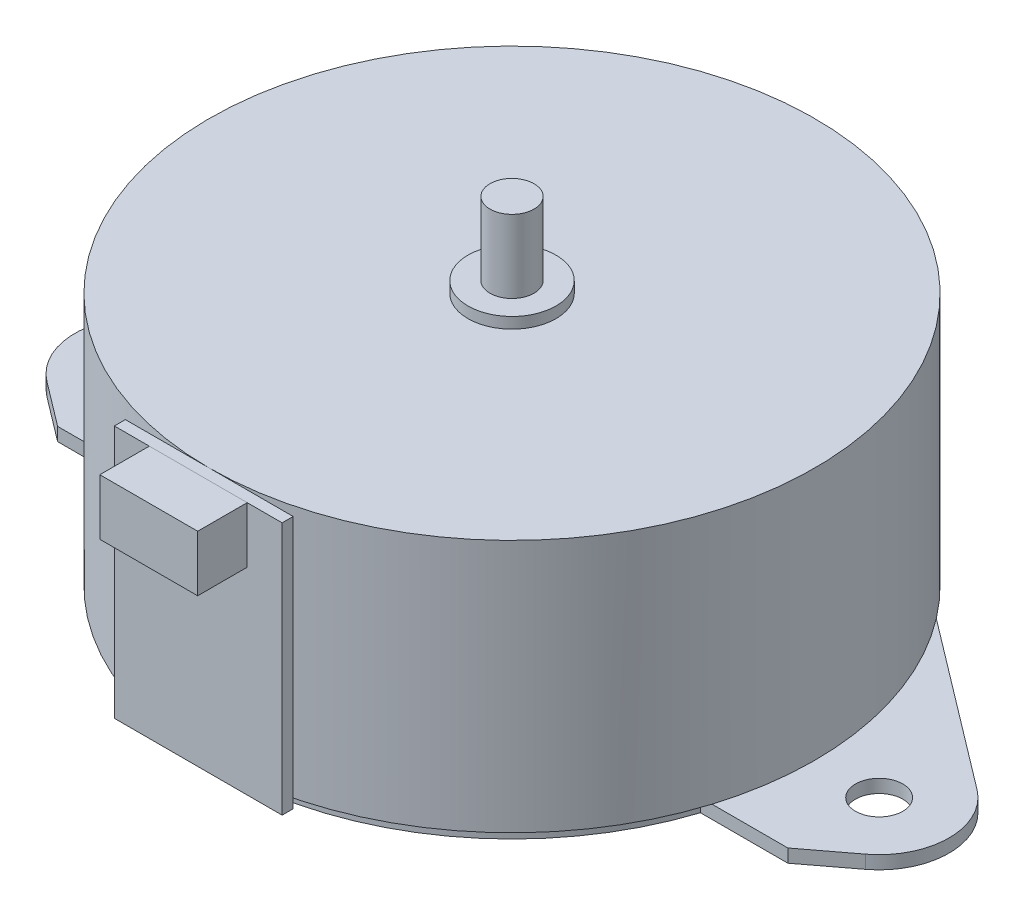
ISO-10303-21;
HEADER;
FILE_DESCRIPTION(('STEP AP214'),'2;1');
FILE_NAME('part.step','',(''),(''),'','','');
FILE_SCHEMA(('AUTOMOTIVE_DESIGN { 1 0 10303 214 1 1 1 1 }'));
ENDSEC;
DATA;
#1=APPLICATION_CONTEXT('core data for automotive mechanical design processes');
#2=APPLICATION_PROTOCOL_DEFINITION('international standard','automotive_design',2000,#1);
#3=PRODUCT_CONTEXT('',#1,'mechanical');
#4=PRODUCT('Part','Part','',(#3));
#5=PRODUCT_RELATED_PRODUCT_CATEGORY('part','',(#4));
#6=PRODUCT_DEFINITION_FORMATION('','',#4);
#7=PRODUCT_DEFINITION_CONTEXT('part definition',#1,'design');
#8=PRODUCT_DEFINITION('design','',#6,#7);
#9=PRODUCT_DEFINITION_SHAPE('','',#8);
#10=(LENGTH_UNIT() NAMED_UNIT(*) SI_UNIT(.MILLI.,.METRE.));
#11=(NAMED_UNIT(*) PLANE_ANGLE_UNIT() SI_UNIT($,.RADIAN.));
#12=(NAMED_UNIT(*) SI_UNIT($,.STERADIAN.) SOLID_ANGLE_UNIT());
#13=UNCERTAINTY_MEASURE_WITH_UNIT(LENGTH_MEASURE(1.E-05),#10,'distance_accuracy_value','');
#14=(GEOMETRIC_REPRESENTATION_CONTEXT(3) GLOBAL_UNCERTAINTY_ASSIGNED_CONTEXT((#13)) GLOBAL_UNIT_ASSIGNED_CONTEXT((#10,
#11,#12)) REPRESENTATION_CONTEXT('',''));
#15=CARTESIAN_POINT('',(0.,0.,0.));
#16=DIRECTION('',(0.,0.,1.));
#17=DIRECTION('',(1.,0.,0.));
#18=AXIS2_PLACEMENT_3D('',#15,#16,#17);
#19=CARTESIAN_POINT('',(-4.445,24.2,32.9958));
#20=DIRECTION('',(1.,0.,0.));
#21=DIRECTION('',(0.,1.,0.));
#22=AXIS2_PLACEMENT_3D('',#19,#20,#21);
#23=PLANE('',#22);
#24=DIRECTION('',(0.,-1.,0.));
#25=VECTOR('',#24,1.);
#26=CARTESIAN_POINT('',(-4.445,24.2,28.5));
#27=LINE('',#26,#25);
#28=CARTESIAN_POINT('',(-4.445,24.2,28.5));
#29=VERTEX_POINT('',#28);
#30=CARTESIAN_POINT('',(-4.445,19.12,28.5));
#31=VERTEX_POINT('',#30);
#32=EDGE_CURVE('E178',#29,#31,#27,.T.);
#33=ORIENTED_EDGE('',*,*,#32,.T.);
#34=DIRECTION('',(0.,0.,-1.));
#35=VECTOR('',#34,1.);
#36=CARTESIAN_POINT('',(-4.445,19.12,32.9958));
#37=LINE('',#36,#35);
#38=CARTESIAN_POINT('',(-4.445,19.12,32.9958));
#39=VERTEX_POINT('',#38);
#40=EDGE_CURVE('E13',#39,#31,#37,.T.);
#41=ORIENTED_EDGE('',*,*,#40,.F.);
#42=DIRECTION('',(0.,-1.,0.));
#43=VECTOR('',#42,1.);
#44=CARTESIAN_POINT('',(-4.445,24.2,32.9958));
#45=LINE('',#44,#43);
#46=CARTESIAN_POINT('',(-4.445,24.2,32.9958));
#47=VERTEX_POINT('',#46);
#48=EDGE_CURVE('E166',#47,#39,#45,.T.);
#49=ORIENTED_EDGE('',*,*,#48,.F.);
#50=DIRECTION('',(0.,0.,-1.));
#51=VECTOR('',#50,1.);
#52=CARTESIAN_POINT('',(-4.445,24.2,32.9958));
#53=LINE('',#52,#51);
#54=EDGE_CURVE('E174',#47,#29,#53,.T.);
#55=ORIENTED_EDGE('',*,*,#54,.T.);
#56=EDGE_LOOP('',(#33,#41,#49,#55));
#57=FACE_BOUND('',#56,.T.);
#58=ADVANCED_FACE('F115',(#57),#23,.F.);
#59=CARTESIAN_POINT('',(-4.445,19.12,32.9958));
#60=DIRECTION('',(0.,1.,0.));
#61=DIRECTION('',(0.,0.,1.));
#62=AXIS2_PLACEMENT_3D('',#59,#60,#61);
#63=PLANE('',#62);
#64=DIRECTION('',(1.,0.,0.));
#65=VECTOR('',#64,1.);
#66=CARTESIAN_POINT('',(-4.445,19.12,28.5));
#67=LINE('',#66,#65);
#68=CARTESIAN_POINT('',(4.445,19.12,28.5));
#69=VERTEX_POINT('',#68);
#70=EDGE_CURVE('E170',#31,#69,#67,.T.);
#71=ORIENTED_EDGE('',*,*,#70,.T.);
#72=DIRECTION('',(0.,0.,-1.));
#73=VECTOR('',#72,1.);
#74=CARTESIAN_POINT('',(4.445,19.12,32.9958));
#75=LINE('',#74,#73);
#76=CARTESIAN_POINT('',(4.445,19.12,32.9958));
#77=VERTEX_POINT('',#76);
#78=EDGE_CURVE('E123',#77,#69,#75,.T.);
#79=ORIENTED_EDGE('',*,*,#78,.F.);
#80=DIRECTION('',(1.,0.,0.));
#81=VECTOR('',#80,1.);
#82=CARTESIAN_POINT('',(-4.445,19.12,32.9958));
#83=LINE('',#82,#81);
#84=EDGE_CURVE('E161',#39,#77,#83,.T.);
#85=ORIENTED_EDGE('',*,*,#84,.F.);
#86=ORIENTED_EDGE('',*,*,#40,.T.);
#87=EDGE_LOOP('',(#71,#79,#85,#86));
#88=FACE_BOUND('',#87,.T.);
#89=ADVANCED_FACE('F169',(#88),#63,.F.);
#90=CARTESIAN_POINT('',(4.445,24.2,32.9958));
#91=DIRECTION('',(-1.,0.,0.));
#92=DIRECTION('',(0.,-1.,0.));
#93=AXIS2_PLACEMENT_3D('',#90,#91,#92);
#94=PLANE('',#93);
#95=DIRECTION('',(0.,1.,0.));
#96=VECTOR('',#95,1.);
#97=CARTESIAN_POINT('',(4.445,24.2,28.5));
#98=LINE('',#97,#96);
#99=CARTESIAN_POINT('',(4.445,24.2,28.5));
#100=VERTEX_POINT('',#99);
#101=EDGE_CURVE('E148',#69,#100,#98,.T.);
#102=ORIENTED_EDGE('',*,*,#101,.T.);
#103=DIRECTION('',(0.,0.,-1.));
#104=VECTOR('',#103,1.);
#105=CARTESIAN_POINT('',(4.445,24.2,32.9958));
#106=LINE('',#105,#104);
#107=CARTESIAN_POINT('',(4.445,24.2,32.9958));
#108=VERTEX_POINT('',#107);
#109=EDGE_CURVE('E171',#108,#100,#106,.T.);
#110=ORIENTED_EDGE('',*,*,#109,.F.);
#111=DIRECTION('',(0.,1.,0.));
#112=VECTOR('',#111,1.);
#113=CARTESIAN_POINT('',(4.445,24.2,32.9958));
#114=LINE('',#113,#112);
#115=EDGE_CURVE('E164',#77,#108,#114,.T.);
#116=ORIENTED_EDGE('',*,*,#115,.F.);
#117=ORIENTED_EDGE('',*,*,#78,.T.);
#118=EDGE_LOOP('',(#102,#110,#116,#117));
#119=FACE_BOUND('',#118,.T.);
#120=ADVANCED_FACE('F172',(#119),#94,.F.);
#121=CARTESIAN_POINT('',(-4.445,24.2,32.9958));
#122=DIRECTION('',(0.,-1.,0.));
#123=DIRECTION('',(0.,0.,-1.));
#124=AXIS2_PLACEMENT_3D('',#121,#122,#123);
#125=PLANE('',#124);
#126=DIRECTION('',(-1.,0.,0.));
#127=VECTOR('',#126,1.);
#128=CARTESIAN_POINT('',(-4.445,24.2,28.5));
#129=LINE('',#128,#127);
#130=EDGE_CURVE('E154',#100,#29,#129,.T.);
#131=ORIENTED_EDGE('',*,*,#130,.T.);
#132=ORIENTED_EDGE('',*,*,#54,.F.);
#133=DIRECTION('',(-1.,0.,0.));
#134=VECTOR('',#133,1.);
#135=CARTESIAN_POINT('',(-4.445,24.2,32.9958));
#136=LINE('',#135,#134);
#137=EDGE_CURVE('E131',#108,#47,#136,.T.);
#138=ORIENTED_EDGE('',*,*,#137,.F.);
#139=ORIENTED_EDGE('',*,*,#109,.T.);
#140=EDGE_LOOP('',(#131,#132,#138,#139));
#141=FACE_BOUND('',#140,.T.);
#142=ADVANCED_FACE('F185',(#141),#125,.F.);
#143=CARTESIAN_POINT('',(0.,0.,32.9958));
#144=DIRECTION('',(0.,0.,1.));
#145=DIRECTION('',(1.,0.,0.));
#146=AXIS2_PLACEMENT_3D('',#143,#144,#145);
#147=PLANE('',#146);
#148=ORIENTED_EDGE('',*,*,#48,.T.);
#149=ORIENTED_EDGE('',*,*,#84,.T.);
#150=ORIENTED_EDGE('',*,*,#115,.T.);
#151=ORIENTED_EDGE('',*,*,#137,.T.);
#152=EDGE_LOOP('',(#148,#149,#150,#151));
#153=FACE_BOUND('',#152,.T.);
#154=ADVANCED_FACE('F162',(#153),#147,.T.);
#155=CARTESIAN_POINT('',(0.,0.,28.5));
#156=DIRECTION('',(0.,0.,1.));
#157=DIRECTION('',(1.,0.,0.));
#158=AXIS2_PLACEMENT_3D('',#155,#156,#157);
#159=PLANE('',#158);
#160=ORIENTED_EDGE('',*,*,#32,.F.);
#161=ORIENTED_EDGE('',*,*,#130,.F.);
#162=ORIENTED_EDGE('',*,*,#101,.F.);
#163=ORIENTED_EDGE('',*,*,#70,.F.);
#164=EDGE_LOOP('',(#160,#161,#162,#163));
#165=FACE_BOUND('',#164,.T.);
#166=ADVANCED_FACE('F188',(#165),#159,.F.);
#167=CLOSED_SHELL('',(#58,#89,#120,#142,#154,#166));
#168=MANIFOLD_SOLID_BREP('B2',#167);
#169=CARTESIAN_POINT('',(-7.62,24.2,28.5));
#170=DIRECTION('',(1.,0.,0.));
#171=DIRECTION('',(0.,1.,0.));
#172=AXIS2_PLACEMENT_3D('',#169,#170,#171);
#173=PLANE('',#172);
#174=DIRECTION('',(0.,-1.,0.));
#175=VECTOR('',#174,1.);
#176=CARTESIAN_POINT('',(-7.62,24.2,27.5));
#177=LINE('',#176,#175);
#178=CARTESIAN_POINT('',(-7.62,24.2,27.5));
#179=VERTEX_POINT('',#178);
#180=CARTESIAN_POINT('',(-7.62,1.2,27.5));
#181=VERTEX_POINT('',#180);
#182=EDGE_CURVE('E311',#179,#181,#177,.T.);
#183=ORIENTED_EDGE('',*,*,#182,.T.);
#184=DIRECTION('',(0.,0.,-1.));
#185=VECTOR('',#184,1.);
#186=CARTESIAN_POINT('',(-7.62,1.2,28.5));
#187=LINE('',#186,#185);
#188=CARTESIAN_POINT('',(-7.62,1.2,28.5));
#189=VERTEX_POINT('',#188);
#190=EDGE_CURVE('E113',#189,#181,#187,.T.);
#191=ORIENTED_EDGE('',*,*,#190,.F.);
#192=DIRECTION('',(0.,-1.,0.));
#193=VECTOR('',#192,1.);
#194=CARTESIAN_POINT('',(-7.62,24.2,28.5));
#195=LINE('',#194,#193);
#196=CARTESIAN_POINT('',(-7.62,24.2,28.5));
#197=VERTEX_POINT('',#196);
#198=EDGE_CURVE('E299',#197,#189,#195,.T.);
#199=ORIENTED_EDGE('',*,*,#198,.F.);
#200=DIRECTION('',(0.,0.,-1.));
#201=VECTOR('',#200,1.);
#202=CARTESIAN_POINT('',(-7.62,24.2,28.5));
#203=LINE('',#202,#201);
#204=EDGE_CURVE('E307',#197,#179,#203,.T.);
#205=ORIENTED_EDGE('',*,*,#204,.T.);
#206=EDGE_LOOP('',(#183,#191,#199,#205));
#207=FACE_BOUND('',#206,.T.);
#208=ADVANCED_FACE('F248',(#207),#173,.F.);
#209=CARTESIAN_POINT('',(-7.62,1.2,28.5));
#210=DIRECTION('',(0.,1.,0.));
#211=DIRECTION('',(-1.,0.,0.));
#212=AXIS2_PLACEMENT_3D('',#209,#210,#211);
#213=PLANE('',#212);
#214=DIRECTION('',(1.,0.,0.));
#215=VECTOR('',#214,1.);
#216=CARTESIAN_POINT('',(-7.62,1.2,27.5));
#217=LINE('',#216,#215);
#218=CARTESIAN_POINT('',(7.62,1.2,27.5));
#219=VERTEX_POINT('',#218);
#220=EDGE_CURVE('E303',#181,#219,#217,.T.);
#221=ORIENTED_EDGE('',*,*,#220,.T.);
#222=DIRECTION('',(0.,0.,-1.));
#223=VECTOR('',#222,1.);
#224=CARTESIAN_POINT('',(7.62,1.2,28.5));
#225=LINE('',#224,#223);
#226=CARTESIAN_POINT('',(7.62,1.2,28.5));
#227=VERTEX_POINT('',#226);
#228=EDGE_CURVE('E256',#227,#219,#225,.T.);
#229=ORIENTED_EDGE('',*,*,#228,.F.);
#230=DIRECTION('',(1.,0.,0.));
#231=VECTOR('',#230,1.);
#232=CARTESIAN_POINT('',(-7.62,1.2,28.5));
#233=LINE('',#232,#231);
#234=EDGE_CURVE('E294',#189,#227,#233,.T.);
#235=ORIENTED_EDGE('',*,*,#234,.F.);
#236=ORIENTED_EDGE('',*,*,#190,.T.);
#237=EDGE_LOOP('',(#221,#229,#235,#236));
#238=FACE_BOUND('',#237,.T.);
#239=ADVANCED_FACE('F302',(#238),#213,.F.);
#240=CARTESIAN_POINT('',(7.61999999999999,24.2,28.5));
#241=DIRECTION('',(-1.,0.,0.));
#242=DIRECTION('',(0.,-1.,0.));
#243=AXIS2_PLACEMENT_3D('',#240,#241,#242);
#244=PLANE('',#243);
#245=DIRECTION('',(0.,1.,0.));
#246=VECTOR('',#245,1.);
#247=CARTESIAN_POINT('',(7.61999999999999,24.2,27.5));
#248=LINE('',#247,#246);
#249=CARTESIAN_POINT('',(7.61999999999999,24.2,27.5));
#250=VERTEX_POINT('',#249);
#251=EDGE_CURVE('E281',#219,#250,#248,.T.);
#252=ORIENTED_EDGE('',*,*,#251,.T.);
#253=DIRECTION('',(0.,0.,-1.));
#254=VECTOR('',#253,1.);
#255=CARTESIAN_POINT('',(7.61999999999999,24.2,28.5));
#256=LINE('',#255,#254);
#257=CARTESIAN_POINT('',(7.61999999999999,24.2,28.5));
#258=VERTEX_POINT('',#257);
#259=EDGE_CURVE('E304',#258,#250,#256,.T.);
#260=ORIENTED_EDGE('',*,*,#259,.F.);
#261=DIRECTION('',(0.,1.,0.));
#262=VECTOR('',#261,1.);
#263=CARTESIAN_POINT('',(7.61999999999999,24.2,28.5));
#264=LINE('',#263,#262);
#265=EDGE_CURVE('E297',#227,#258,#264,.T.);
#266=ORIENTED_EDGE('',*,*,#265,.F.);
#267=ORIENTED_EDGE('',*,*,#228,.T.);
#268=EDGE_LOOP('',(#252,#260,#266,#267));
#269=FACE_BOUND('',#268,.T.);
#270=ADVANCED_FACE('F305',(#269),#244,.F.);
#271=CARTESIAN_POINT('',(-7.62,24.2,28.5));
#272=DIRECTION('',(0.,-1.,0.));
#273=DIRECTION('',(1.,0.,0.));
#274=AXIS2_PLACEMENT_3D('',#271,#272,#273);
#275=PLANE('',#274);
#276=DIRECTION('',(-1.,0.,0.));
#277=VECTOR('',#276,1.);
#278=CARTESIAN_POINT('',(-7.62,24.2,27.5));
#279=LINE('',#278,#277);
#280=EDGE_CURVE('E287',#250,#179,#279,.T.);
#281=ORIENTED_EDGE('',*,*,#280,.T.);
#282=ORIENTED_EDGE('',*,*,#204,.F.);
#283=DIRECTION('',(-1.,0.,0.));
#284=VECTOR('',#283,1.);
#285=CARTESIAN_POINT('',(-7.62,24.2,28.5));
#286=LINE('',#285,#284);
#287=EDGE_CURVE('E264',#258,#197,#286,.T.);
#288=ORIENTED_EDGE('',*,*,#287,.F.);
#289=ORIENTED_EDGE('',*,*,#259,.T.);
#290=EDGE_LOOP('',(#281,#282,#288,#289));
#291=FACE_BOUND('',#290,.T.);
#292=ADVANCED_FACE('F318',(#291),#275,.F.);
#293=CARTESIAN_POINT('',(0.,0.,28.5));
#294=DIRECTION('',(0.,0.,1.));
#295=DIRECTION('',(1.,0.,0.));
#296=AXIS2_PLACEMENT_3D('',#293,#294,#295);
#297=PLANE('',#296);
#298=ORIENTED_EDGE('',*,*,#198,.T.);
#299=ORIENTED_EDGE('',*,*,#234,.T.);
#300=ORIENTED_EDGE('',*,*,#265,.T.);
#301=ORIENTED_EDGE('',*,*,#287,.T.);
#302=EDGE_LOOP('',(#298,#299,#300,#301));
#303=FACE_BOUND('',#302,.T.);
#304=ADVANCED_FACE('F295',(#303),#297,.T.);
#305=CARTESIAN_POINT('',(0.,0.,27.5));
#306=DIRECTION('',(0.,0.,1.));
#307=DIRECTION('',(1.,0.,0.));
#308=AXIS2_PLACEMENT_3D('',#305,#306,#307);
#309=PLANE('',#308);
#310=ORIENTED_EDGE('',*,*,#182,.F.);
#311=ORIENTED_EDGE('',*,*,#280,.F.);
#312=ORIENTED_EDGE('',*,*,#251,.F.);
#313=ORIENTED_EDGE('',*,*,#220,.F.);
#314=EDGE_LOOP('',(#310,#311,#312,#313));
#315=FACE_BOUND('',#314,.T.);
#316=ADVANCED_FACE('F321',(#315),#309,.F.);
#317=CLOSED_SHELL('',(#208,#239,#270,#292,#304,#316));
#318=MANIFOLD_SOLID_BREP('B7',#317);
#319=CARTESIAN_POINT('',(0.,1.2,0.));
#320=DIRECTION('',(0.,1.,0.));
#321=DIRECTION('',(0.,0.,1.));
#322=AXIS2_PLACEMENT_3D('',#319,#320,#321);
#323=PLANE('',#322);
#324=CARTESIAN_POINT('',(0.,1.2,0.));
#325=DIRECTION('',(0.,1.,0.));
#326=DIRECTION('',(0.,0.,1.));
#327=AXIS2_PLACEMENT_3D('',#324,#325,#326);
#328=CIRCLE('',#327,27.5);
#329=CARTESIAN_POINT('',(26.2769461695989,1.2,8.11));
#330=VERTEX_POINT('',#329);
#331=CARTESIAN_POINT('',(21.8667566870664,1.2,-16.6761791783561));
#332=VERTEX_POINT('',#331);
#333=EDGE_CURVE('E392',#330,#332,#328,.T.);
#334=ORIENTED_EDGE('',*,*,#333,.F.);
#335=DIRECTION('',(-1.,0.,0.));
#336=VECTOR('',#335,1.);
#337=CARTESIAN_POINT('',(33.1640904728577,1.2,8.11));
#338=LINE('',#337,#336);
#339=CARTESIAN_POINT('',(33.1640904728577,1.2,8.11));
#340=VERTEX_POINT('',#339);
#341=EDGE_CURVE('E692',#340,#330,#338,.T.);
#342=ORIENTED_EDGE('',*,*,#341,.F.);
#343=DIRECTION('',(-0.796834296681191,0.,0.604197901049475));
#344=VECTOR('',#343,1.);
#345=CARTESIAN_POINT('',(37.1866566716642,1.2,5.05989778392557));
#346=LINE('',#345,#344);
#347=CARTESIAN_POINT('',(37.1866566716642,1.2,5.05989778392557));
#348=VERTEX_POINT('',#347);
#349=EDGE_CURVE('E694',#348,#340,#346,.T.);
#350=ORIENTED_EDGE('',*,*,#349,.F.);
#351=CARTESIAN_POINT('',(33.35,1.2,0.));
#352=DIRECTION('',(0.,-1.,0.));
#353=DIRECTION('',(0.,0.,-1.));
#354=AXIS2_PLACEMENT_3D('',#351,#352,#353);
#355=CIRCLE('',#354,6.35);
#356=CARTESIAN_POINT('',(37.1866566716642,1.2,-5.05989778392556));
#357=VERTEX_POINT('',#356);
#358=EDGE_CURVE('E697',#357,#348,#355,.T.);
#359=ORIENTED_EDGE('',*,*,#358,.F.);
#360=DIRECTION('',(0.796834296681191,0.,0.604197901049475));
#361=VECTOR('',#360,1.);
#362=CARTESIAN_POINT('',(16.0112443778111,1.2,-21.1161088620516));
#363=LINE('',#362,#361);
#364=EDGE_CURVE('E387',#332,#357,#363,.T.);
#365=ORIENTED_EDGE('',*,*,#364,.F.);
#366=EDGE_LOOP('',(#334,#342,#350,#359,#365));
#367=FACE_BOUND('',#366,.T.);
#368=CARTESIAN_POINT('',(33.35,1.2,0.));
#369=DIRECTION('',(0.,-1.,0.));
#370=DIRECTION('',(0.,0.,-1.));
#371=AXIS2_PLACEMENT_3D('',#368,#369,#370);
#372=CIRCLE('',#371,2.15000000000002);
#373=CARTESIAN_POINT('',(33.35,1.2,-2.15000000000002));
#374=VERTEX_POINT('',#373);
#375=EDGE_CURVE('E510',#374,#374,#372,.T.);
#376=ORIENTED_EDGE('',*,*,#375,.T.);
#377=EDGE_LOOP('',(#376));
#378=FACE_BOUND('',#377,.T.);
#379=ADVANCED_FACE('F372',(#367,#378),#323,.T.);
#380=CARTESIAN_POINT('',(-21.8667566870664,1.2,-16.6761791783561));
#381=VERTEX_POINT('',#380);
#382=CARTESIAN_POINT('',(-26.2769461695989,1.2,8.11));
#383=VERTEX_POINT('',#382);
#384=EDGE_CURVE('E465',#381,#383,#328,.T.);
#385=ORIENTED_EDGE('',*,*,#384,.F.);
#386=DIRECTION('',(-0.796834296681191,0.,0.604197901049475));
#387=VECTOR('',#386,1.);
#388=CARTESIAN_POINT('',(-16.0112443778111,1.2,-21.1161088620516));
#389=LINE('',#388,#387);
#390=CARTESIAN_POINT('',(-37.1866566716642,1.2,-5.05989778392556));
#391=VERTEX_POINT('',#390);
#392=EDGE_CURVE('E685',#381,#391,#389,.T.);
#393=ORIENTED_EDGE('',*,*,#392,.T.);
#394=CARTESIAN_POINT('',(-33.35,1.2,0.));
#395=DIRECTION('',(0.,1.,0.));
#396=DIRECTION('',(0.,0.,1.));
#397=AXIS2_PLACEMENT_3D('',#394,#395,#396);
#398=CIRCLE('',#397,6.35);
#399=CARTESIAN_POINT('',(-37.1866566716642,1.2,5.05989778392556));
#400=VERTEX_POINT('',#399);
#401=EDGE_CURVE('E617',#391,#400,#398,.T.);
#402=ORIENTED_EDGE('',*,*,#401,.T.);
#403=DIRECTION('',(0.796834296681191,0.,0.604197901049475));
#404=VECTOR('',#403,1.);
#405=CARTESIAN_POINT('',(-37.1866566716642,1.2,5.05989778392557));
#406=LINE('',#405,#404);
#407=CARTESIAN_POINT('',(-33.1640904728577,1.2,8.11));
#408=VERTEX_POINT('',#407);
#409=EDGE_CURVE('E468',#400,#408,#406,.T.);
#410=ORIENTED_EDGE('',*,*,#409,.T.);
#411=DIRECTION('',(1.,0.,0.));
#412=VECTOR('',#411,1.);
#413=CARTESIAN_POINT('',(-33.1640904728577,1.2,8.11));
#414=LINE('',#413,#412);
#415=EDGE_CURVE('E460',#408,#383,#414,.T.);
#416=ORIENTED_EDGE('',*,*,#415,.T.);
#417=EDGE_LOOP('',(#385,#393,#402,#410,#416));
#418=FACE_BOUND('',#417,.T.);
#419=CARTESIAN_POINT('',(-33.35,1.2,0.));
#420=DIRECTION('',(0.,1.,0.));
#421=DIRECTION('',(0.,0.,1.));
#422=AXIS2_PLACEMENT_3D('',#419,#420,#421);
#423=CIRCLE('',#422,2.15);
#424=CARTESIAN_POINT('',(-33.35,1.2,2.15));
#425=VERTEX_POINT('',#424);
#426=EDGE_CURVE('E678',#425,#425,#423,.T.);
#427=ORIENTED_EDGE('',*,*,#426,.F.);
#428=EDGE_LOOP('',(#427));
#429=FACE_BOUND('',#428,.T.);
#430=ADVANCED_FACE('F462',(#418,#429),#323,.T.);
#431=CARTESIAN_POINT('',(0.,0.,0.));
#432=DIRECTION('',(0.,1.,0.));
#433=DIRECTION('',(0.,0.,1.));
#434=AXIS2_PLACEMENT_3D('',#431,#432,#433);
#435=PLANE('',#434);
#436=CARTESIAN_POINT('',(0.,0.,0.));
#437=DIRECTION('',(0.,1.,0.));
#438=DIRECTION('',(0.,0.,1.));
#439=AXIS2_PLACEMENT_3D('',#436,#437,#438);
#440=CIRCLE('',#439,5.565);
#441=CARTESIAN_POINT('',(0.,0.,5.565));
#442=VERTEX_POINT('',#441);
#443=EDGE_CURVE('E380',#442,#442,#440,.F.);
#444=ORIENTED_EDGE('',*,*,#443,.F.);
#445=EDGE_LOOP('',(#444));
#446=FACE_BOUND('',#445,.T.);
#447=CARTESIAN_POINT('',(33.35,0.,0.));
#448=DIRECTION('',(0.,-1.,0.));
#449=DIRECTION('',(0.,0.,-1.));
#450=AXIS2_PLACEMENT_3D('',#447,#448,#449);
#451=CIRCLE('',#450,2.15000000000002);
#452=CARTESIAN_POINT('',(33.35,0.,-2.15000000000002));
#453=VERTEX_POINT('',#452);
#454=EDGE_CURVE('E506',#453,#453,#451,.T.);
#455=ORIENTED_EDGE('',*,*,#454,.F.);
#456=EDGE_LOOP('',(#455));
#457=FACE_BOUND('',#456,.T.);
#458=CARTESIAN_POINT('',(0.,0.,0.));
#459=DIRECTION('',(0.,1.,0.));
#460=DIRECTION('',(0.,0.,1.));
#461=AXIS2_PLACEMENT_3D('',#458,#459,#460);
#462=CIRCLE('',#461,26.5);
#463=CARTESIAN_POINT('',(16.0112443778111,0.,-21.1161088620516));
#464=VERTEX_POINT('',#463);
#465=CARTESIAN_POINT('',(-16.0112443778111,0.,-21.1161088620516));
#466=VERTEX_POINT('',#465);
#467=EDGE_CURVE('E613',#464,#466,#462,.T.);
#468=ORIENTED_EDGE('',*,*,#467,.F.);
#469=DIRECTION('',(0.796834296681191,0.,0.604197901049475));
#470=VECTOR('',#469,1.);
#471=CARTESIAN_POINT('',(16.0112443778111,0.,-21.1161088620516));
#472=LINE('',#471,#470);
#473=CARTESIAN_POINT('',(37.1866566716642,0.,-5.05989778392556));
#474=VERTEX_POINT('',#473);
#475=EDGE_CURVE('E642',#464,#474,#472,.T.);
#476=ORIENTED_EDGE('',*,*,#475,.T.);
#477=CARTESIAN_POINT('',(33.35,0.,0.));
#478=DIRECTION('',(0.,-1.,0.));
#479=DIRECTION('',(0.,0.,-1.));
#480=AXIS2_PLACEMENT_3D('',#477,#478,#479);
#481=CIRCLE('',#480,6.35);
#482=CARTESIAN_POINT('',(37.1866566716642,0.,5.05989778392557));
#483=VERTEX_POINT('',#482);
#484=EDGE_CURVE('E639',#474,#483,#481,.T.);
#485=ORIENTED_EDGE('',*,*,#484,.T.);
#486=DIRECTION('',(-0.796834296681191,0.,0.604197901049475));
#487=VECTOR('',#486,1.);
#488=CARTESIAN_POINT('',(37.1866566716642,0.,5.05989778392557));
#489=LINE('',#488,#487);
#490=CARTESIAN_POINT('',(33.1640904728577,0.,8.11));
#491=VERTEX_POINT('',#490);
#492=EDGE_CURVE('E636',#483,#491,#489,.T.);
#493=ORIENTED_EDGE('',*,*,#492,.T.);
#494=DIRECTION('',(-1.,0.,0.));
#495=VECTOR('',#494,1.);
#496=CARTESIAN_POINT('',(33.1640904728577,0.,8.11));
#497=LINE('',#496,#495);
#498=CARTESIAN_POINT('',(25.2285136304143,0.,8.10999999999999));
#499=VERTEX_POINT('',#498);
#500=EDGE_CURVE('E633',#491,#499,#497,.T.);
#501=ORIENTED_EDGE('',*,*,#500,.T.);
#502=CARTESIAN_POINT('',(0.,0.,0.));
#503=DIRECTION('',(0.,1.,0.));
#504=DIRECTION('',(0.,0.,1.));
#505=AXIS2_PLACEMENT_3D('',#502,#503,#504);
#506=CIRCLE('',#505,26.5);
#507=CARTESIAN_POINT('',(-25.2285136304143,0.,8.11));
#508=VERTEX_POINT('',#507);
#509=EDGE_CURVE('E630',#508,#499,#506,.T.);
#510=ORIENTED_EDGE('',*,*,#509,.F.);
#511=DIRECTION('',(1.,0.,0.));
#512=VECTOR('',#511,1.);
#513=CARTESIAN_POINT('',(-33.1640904728577,0.,8.11));
#514=LINE('',#513,#512);
#515=CARTESIAN_POINT('',(-33.1640904728577,0.,8.11));
#516=VERTEX_POINT('',#515);
#517=EDGE_CURVE('E625',#516,#508,#514,.T.);
#518=ORIENTED_EDGE('',*,*,#517,.F.);
#519=DIRECTION('',(0.796834296681191,0.,0.604197901049475));
#520=VECTOR('',#519,1.);
#521=CARTESIAN_POINT('',(-37.1866566716642,0.,5.05989778392557));
#522=LINE('',#521,#520);
#523=CARTESIAN_POINT('',(-37.1866566716642,0.,5.05989778392556));
#524=VERTEX_POINT('',#523);
#525=EDGE_CURVE('E623',#524,#516,#522,.T.);
#526=ORIENTED_EDGE('',*,*,#525,.F.);
#527=CARTESIAN_POINT('',(-33.35,0.,0.));
#528=DIRECTION('',(0.,1.,0.));
#529=DIRECTION('',(0.,0.,1.));
#530=AXIS2_PLACEMENT_3D('',#527,#528,#529);
#531=CIRCLE('',#530,6.35);
#532=CARTESIAN_POINT('',(-37.1866566716642,0.,-5.05989778392556));
#533=VERTEX_POINT('',#532);
#534=EDGE_CURVE('E612',#533,#524,#531,.T.);
#535=ORIENTED_EDGE('',*,*,#534,.F.);
#536=DIRECTION('',(-0.796834296681191,0.,0.604197901049475));
#537=VECTOR('',#536,1.);
#538=CARTESIAN_POINT('',(-16.0112443778111,0.,-21.1161088620516));
#539=LINE('',#538,#537);
#540=EDGE_CURVE('E604',#466,#533,#539,.T.);
#541=ORIENTED_EDGE('',*,*,#540,.F.);
#542=EDGE_LOOP('',(#468,#476,#485,#493,#501,#510,#518,#526,#535,#541));
#543=FACE_BOUND('',#542,.T.);
#544=CARTESIAN_POINT('',(-33.35,0.,0.));
#545=DIRECTION('',(0.,1.,0.));
#546=DIRECTION('',(0.,0.,1.));
#547=AXIS2_PLACEMENT_3D('',#544,#545,#546);
#548=CIRCLE('',#547,2.15);
#549=CARTESIAN_POINT('',(-33.35,0.,2.15));
#550=VERTEX_POINT('',#549);
#551=EDGE_CURVE('E676',#550,#550,#548,.T.);
#552=ORIENTED_EDGE('',*,*,#551,.T.);
#553=EDGE_LOOP('',(#552));
#554=FACE_BOUND('',#553,.T.);
#555=ADVANCED_FACE('F558',(#446,#457,#543,#554),#435,.F.);
#556=CARTESIAN_POINT('',(0.,1.2,0.));
#557=DIRECTION('',(0.,-1.,0.));
#558=DIRECTION('',(0.,0.,-1.));
#559=AXIS2_PLACEMENT_3D('',#556,#557,#558);
#560=CYLINDRICAL_SURFACE('',#559,26.5);
#561=ORIENTED_EDGE('',*,*,#467,.T.);
#562=DIRECTION('',(0.,-1.,0.));
#563=VECTOR('',#562,1.);
#564=CARTESIAN_POINT('',(-16.0112443778111,1.2,-21.1161088620516));
#565=LINE('',#564,#563);
#566=CARTESIAN_POINT('',(-16.0112443778111,1.2,-21.1161088620516));
#567=VERTEX_POINT('',#566);
#568=EDGE_CURVE('E496',#567,#466,#565,.T.);
#569=ORIENTED_EDGE('',*,*,#568,.F.);
#570=CARTESIAN_POINT('',(0.,1.2,0.));
#571=DIRECTION('',(0.,1.,0.));
#572=DIRECTION('',(0.,0.,1.));
#573=AXIS2_PLACEMENT_3D('',#570,#571,#572);
#574=CIRCLE('',#573,26.5);
#575=CARTESIAN_POINT('',(16.0112443778111,1.2,-21.1161088620516));
#576=VERTEX_POINT('',#575);
#577=EDGE_CURVE('E645',#576,#567,#574,.T.);
#578=ORIENTED_EDGE('',*,*,#577,.F.);
#579=DIRECTION('',(0.,-1.,0.));
#580=VECTOR('',#579,1.);
#581=CARTESIAN_POINT('',(16.0112443778111,1.2,-21.1161088620516));
#582=LINE('',#581,#580);
#583=EDGE_CURVE('E646',#576,#464,#582,.T.);
#584=ORIENTED_EDGE('',*,*,#583,.T.);
#585=EDGE_LOOP('',(#561,#569,#578,#584));
#586=FACE_BOUND('',#585,.T.);
#587=ADVANCED_FACE('F374',(#586),#560,.T.);
#588=CARTESIAN_POINT('',(-16.0112443778111,1.2,-21.1161088620516));
#589=DIRECTION('',(0.604197901049475,0.,0.796834296681191));
#590=DIRECTION('',(0.796834296681191,0.,-0.604197901049475));
#591=AXIS2_PLACEMENT_3D('',#588,#589,#590);
#592=PLANE('',#591);
#593=ORIENTED_EDGE('',*,*,#540,.T.);
#594=DIRECTION('',(0.,-1.,0.));
#595=VECTOR('',#594,1.);
#596=CARTESIAN_POINT('',(-37.1866566716642,1.2,-5.05989778392556));
#597=LINE('',#596,#595);
#598=EDGE_CURVE('E500',#391,#533,#597,.T.);
#599=ORIENTED_EDGE('',*,*,#598,.F.);
#600=ORIENTED_EDGE('',*,*,#392,.F.);
#601=EDGE_CURVE('E686',#567,#381,#389,.T.);
#602=ORIENTED_EDGE('',*,*,#601,.F.);
#603=ORIENTED_EDGE('',*,*,#568,.T.);
#604=EDGE_LOOP('',(#593,#599,#600,#602,#603));
#605=FACE_BOUND('',#604,.T.);
#606=ADVANCED_FACE('F595',(#605),#592,.F.);
#607=CARTESIAN_POINT('',(-33.35,1.2,0.));
#608=DIRECTION('',(0.,-1.,0.));
#609=DIRECTION('',(0.,0.,-1.));
#610=AXIS2_PLACEMENT_3D('',#607,#608,#609);
#611=CYLINDRICAL_SURFACE('',#610,6.35);
#612=ORIENTED_EDGE('',*,*,#534,.T.);
#613=DIRECTION('',(0.,-1.,0.));
#614=VECTOR('',#613,1.);
#615=CARTESIAN_POINT('',(-37.1866566716642,1.2,5.05989778392556));
#616=LINE('',#615,#614);
#617=EDGE_CURVE('E618',#400,#524,#616,.T.);
#618=ORIENTED_EDGE('',*,*,#617,.F.);
#619=ORIENTED_EDGE('',*,*,#401,.F.);
#620=ORIENTED_EDGE('',*,*,#598,.T.);
#621=EDGE_LOOP('',(#612,#618,#619,#620));
#622=FACE_BOUND('',#621,.T.);
#623=ADVANCED_FACE('F592',(#622),#611,.T.);
#624=CARTESIAN_POINT('',(-37.1866566716642,1.2,5.05989778392557));
#625=DIRECTION('',(0.604197901049475,0.,-0.796834296681191));
#626=DIRECTION('',(-0.796834296681192,0.,-0.604197901049475));
#627=AXIS2_PLACEMENT_3D('',#624,#625,#626);
#628=PLANE('',#627);
#629=ORIENTED_EDGE('',*,*,#525,.T.);
#630=DIRECTION('',(0.,-1.,0.));
#631=VECTOR('',#630,1.);
#632=CARTESIAN_POINT('',(-33.1640904728577,1.2,8.11));
#633=LINE('',#632,#631);
#634=EDGE_CURVE('E658',#408,#516,#633,.T.);
#635=ORIENTED_EDGE('',*,*,#634,.F.);
#636=ORIENTED_EDGE('',*,*,#409,.F.);
#637=ORIENTED_EDGE('',*,*,#617,.T.);
#638=EDGE_LOOP('',(#629,#635,#636,#637));
#639=FACE_BOUND('',#638,.T.);
#640=ADVANCED_FACE('F589',(#639),#628,.F.);
#641=CARTESIAN_POINT('',(-33.1640904728577,1.2,8.11));
#642=DIRECTION('',(0.,0.,-1.));
#643=DIRECTION('',(-1.,0.,0.));
#644=AXIS2_PLACEMENT_3D('',#641,#642,#643);
#645=PLANE('',#644);
#646=ORIENTED_EDGE('',*,*,#517,.T.);
#647=DIRECTION('',(0.,-1.,0.));
#648=VECTOR('',#647,1.);
#649=CARTESIAN_POINT('',(-25.2285136304143,1.2,8.11));
#650=LINE('',#649,#648);
#651=CARTESIAN_POINT('',(-25.2285136304143,1.2,8.11));
#652=VERTEX_POINT('',#651);
#653=EDGE_CURVE('E479',#652,#508,#650,.T.);
#654=ORIENTED_EDGE('',*,*,#653,.F.);
#655=EDGE_CURVE('E473',#383,#652,#414,.T.);
#656=ORIENTED_EDGE('',*,*,#655,.F.);
#657=ORIENTED_EDGE('',*,*,#415,.F.);
#658=ORIENTED_EDGE('',*,*,#634,.T.);
#659=EDGE_LOOP('',(#646,#654,#656,#657,#658));
#660=FACE_BOUND('',#659,.T.);
#661=ADVANCED_FACE('F477',(#660),#645,.F.);
#662=CARTESIAN_POINT('',(0.,1.2,0.));
#663=DIRECTION('',(0.,-1.,0.));
#664=DIRECTION('',(0.,0.,-1.));
#665=AXIS2_PLACEMENT_3D('',#662,#663,#664);
#666=CYLINDRICAL_SURFACE('',#665,26.5);
#667=ORIENTED_EDGE('',*,*,#509,.T.);
#668=DIRECTION('',(0.,-1.,0.));
#669=VECTOR('',#668,1.);
#670=CARTESIAN_POINT('',(25.2285136304143,1.2,8.10999999999999));
#671=LINE('',#670,#669);
#672=CARTESIAN_POINT('',(25.2285136304143,1.2,8.10999999999999));
#673=VERTEX_POINT('',#672);
#674=EDGE_CURVE('E655',#673,#499,#671,.T.);
#675=ORIENTED_EDGE('',*,*,#674,.F.);
#676=CARTESIAN_POINT('',(0.,1.2,0.));
#677=DIRECTION('',(0.,1.,0.));
#678=DIRECTION('',(0.,0.,1.));
#679=AXIS2_PLACEMENT_3D('',#676,#677,#678);
#680=CIRCLE('',#679,26.5);
#681=EDGE_CURVE('E472',#652,#673,#680,.T.);
#682=ORIENTED_EDGE('',*,*,#681,.F.);
#683=ORIENTED_EDGE('',*,*,#653,.T.);
#684=EDGE_LOOP('',(#667,#675,#682,#683));
#685=FACE_BOUND('',#684,.T.);
#686=ADVANCED_FACE('F582',(#685),#666,.T.);
#687=CARTESIAN_POINT('',(33.1640904728577,1.2,8.11));
#688=DIRECTION('',(0.,0.,1.));
#689=DIRECTION('',(1.,0.,0.));
#690=AXIS2_PLACEMENT_3D('',#687,#688,#689);
#691=PLANE('',#690);
#692=ORIENTED_EDGE('',*,*,#500,.F.);
#693=DIRECTION('',(0.,-1.,0.));
#694=VECTOR('',#693,1.);
#695=CARTESIAN_POINT('',(33.1640904728577,1.2,8.11));
#696=LINE('',#695,#694);
#697=EDGE_CURVE('E653',#340,#491,#696,.T.);
#698=ORIENTED_EDGE('',*,*,#697,.F.);
#699=ORIENTED_EDGE('',*,*,#341,.T.);
#700=EDGE_CURVE('E487',#330,#673,#338,.T.);
#701=ORIENTED_EDGE('',*,*,#700,.T.);
#702=ORIENTED_EDGE('',*,*,#674,.T.);
#703=EDGE_LOOP('',(#692,#698,#699,#701,#702));
#704=FACE_BOUND('',#703,.T.);
#705=ADVANCED_FACE('F578',(#704),#691,.T.);
#706=CARTESIAN_POINT('',(37.1866566716642,1.2,5.05989778392557));
#707=DIRECTION('',(0.604197901049475,0.,0.796834296681191));
#708=DIRECTION('',(0.796834296681191,0.,-0.604197901049475));
#709=AXIS2_PLACEMENT_3D('',#706,#707,#708);
#710=PLANE('',#709);
#711=ORIENTED_EDGE('',*,*,#492,.F.);
#712=DIRECTION('',(0.,-1.,0.));
#713=VECTOR('',#712,1.);
#714=CARTESIAN_POINT('',(37.1866566716642,1.2,5.05989778392557));
#715=LINE('',#714,#713);
#716=EDGE_CURVE('E651',#348,#483,#715,.T.);
#717=ORIENTED_EDGE('',*,*,#716,.F.);
#718=ORIENTED_EDGE('',*,*,#349,.T.);
#719=ORIENTED_EDGE('',*,*,#697,.T.);
#720=EDGE_LOOP('',(#711,#717,#718,#719));
#721=FACE_BOUND('',#720,.T.);
#722=ADVANCED_FACE('F574',(#721),#710,.T.);
#723=CARTESIAN_POINT('',(33.35,1.2,0.));
#724=DIRECTION('',(0.,-1.,0.));
#725=DIRECTION('',(0.,0.,-1.));
#726=AXIS2_PLACEMENT_3D('',#723,#724,#725);
#727=CYLINDRICAL_SURFACE('',#726,6.35);
#728=ORIENTED_EDGE('',*,*,#484,.F.);
#729=DIRECTION('',(0.,-1.,0.));
#730=VECTOR('',#729,1.);
#731=CARTESIAN_POINT('',(37.1866566716642,1.2,-5.05989778392556));
#732=LINE('',#731,#730);
#733=EDGE_CURVE('E648',#357,#474,#732,.T.);
#734=ORIENTED_EDGE('',*,*,#733,.F.);
#735=ORIENTED_EDGE('',*,*,#358,.T.);
#736=ORIENTED_EDGE('',*,*,#716,.T.);
#737=EDGE_LOOP('',(#728,#734,#735,#736));
#738=FACE_BOUND('',#737,.T.);
#739=ADVANCED_FACE('F570',(#738),#727,.T.);
#740=CARTESIAN_POINT('',(16.0112443778111,1.2,-21.1161088620516));
#741=DIRECTION('',(0.604197901049475,0.,-0.796834296681191));
#742=DIRECTION('',(-0.796834296681191,0.,-0.604197901049475));
#743=AXIS2_PLACEMENT_3D('',#740,#741,#742);
#744=PLANE('',#743);
#745=ORIENTED_EDGE('',*,*,#475,.F.);
#746=ORIENTED_EDGE('',*,*,#583,.F.);
#747=EDGE_CURVE('E649',#576,#332,#363,.T.);
#748=ORIENTED_EDGE('',*,*,#747,.T.);
#749=ORIENTED_EDGE('',*,*,#364,.T.);
#750=ORIENTED_EDGE('',*,*,#733,.T.);
#751=EDGE_LOOP('',(#745,#746,#748,#749,#750));
#752=FACE_BOUND('',#751,.T.);
#753=ADVANCED_FACE('F567',(#752),#744,.T.);
#754=CARTESIAN_POINT('',(-33.35,1.2,0.));
#755=DIRECTION('',(0.,-1.,0.));
#756=DIRECTION('',(0.,0.,-1.));
#757=AXIS2_PLACEMENT_3D('',#754,#755,#756);
#758=CYLINDRICAL_SURFACE('',#757,2.15);
#759=ORIENTED_EDGE('',*,*,#426,.T.);
#760=EDGE_LOOP('',(#759));
#761=FACE_BOUND('',#760,.T.);
#762=ORIENTED_EDGE('',*,*,#551,.F.);
#763=EDGE_LOOP('',(#762));
#764=FACE_BOUND('',#763,.T.);
#765=ADVANCED_FACE('F562',(#761,#764),#758,.F.);
#766=CARTESIAN_POINT('',(33.35,1.2,0.));
#767=DIRECTION('',(0.,-1.,0.));
#768=DIRECTION('',(0.,0.,-1.));
#769=AXIS2_PLACEMENT_3D('',#766,#767,#768);
#770=CYLINDRICAL_SURFACE('',#769,2.15000000000002);
#771=ORIENTED_EDGE('',*,*,#375,.F.);
#772=EDGE_LOOP('',(#771));
#773=FACE_BOUND('',#772,.T.);
#774=ORIENTED_EDGE('',*,*,#454,.T.);
#775=EDGE_LOOP('',(#774));
#776=FACE_BOUND('',#775,.T.);
#777=ADVANCED_FACE('F666',(#773,#776),#770,.F.);
#778=CARTESIAN_POINT('',(0.,1.2,0.));
#779=DIRECTION('',(0.,1.,0.));
#780=DIRECTION('',(0.,0.,1.));
#781=AXIS2_PLACEMENT_3D('',#778,#779,#780);
#782=PLANE('',#781);
#783=EDGE_CURVE('E485',#383,#330,#328,.T.);
#784=ORIENTED_EDGE('',*,*,#783,.F.);
#785=ORIENTED_EDGE('',*,*,#655,.T.);
#786=ORIENTED_EDGE('',*,*,#681,.T.);
#787=ORIENTED_EDGE('',*,*,#700,.F.);
#788=EDGE_LOOP('',(#784,#785,#786,#787));
#789=FACE_BOUND('',#788,.T.);
#790=ADVANCED_FACE('F486',(#789),#782,.F.);
#791=ORIENTED_EDGE('',*,*,#577,.T.);
#792=ORIENTED_EDGE('',*,*,#601,.T.);
#793=EDGE_CURVE('E489',#332,#381,#328,.T.);
#794=ORIENTED_EDGE('',*,*,#793,.F.);
#795=ORIENTED_EDGE('',*,*,#747,.F.);
#796=EDGE_LOOP('',(#791,#792,#794,#795));
#797=FACE_BOUND('',#796,.T.);
#798=ADVANCED_FACE('F548',(#797),#782,.F.);
#799=CARTESIAN_POINT('',(0.,24.2,0.));
#800=DIRECTION('',(0.,-1.,0.));
#801=DIRECTION('',(0.,0.,-1.));
#802=AXIS2_PLACEMENT_3D('',#799,#800,#801);
#803=CYLINDRICAL_SURFACE('',#802,27.5);
#804=CARTESIAN_POINT('',(0.,24.2,0.));
#805=DIRECTION('',(0.,1.,0.));
#806=DIRECTION('',(0.,0.,1.));
#807=AXIS2_PLACEMENT_3D('',#804,#805,#806);
#808=CIRCLE('',#807,27.5);
#809=CARTESIAN_POINT('',(0.,24.2,27.5));
#810=VERTEX_POINT('',#809);
#811=EDGE_CURVE('E504',#810,#810,#808,.T.);
#812=ORIENTED_EDGE('',*,*,#811,.F.);
#813=EDGE_LOOP('',(#812));
#814=FACE_BOUND('',#813,.T.);
#815=ORIENTED_EDGE('',*,*,#333,.T.);
#816=ORIENTED_EDGE('',*,*,#793,.T.);
#817=ORIENTED_EDGE('',*,*,#384,.T.);
#818=ORIENTED_EDGE('',*,*,#783,.T.);
#819=EDGE_LOOP('',(#815,#816,#817,#818));
#820=FACE_BOUND('',#819,.T.);
#821=ADVANCED_FACE('F493',(#814,#820),#803,.T.);
#822=CARTESIAN_POINT('',(0.,24.2,0.));
#823=DIRECTION('',(0.,1.,0.));
#824=DIRECTION('',(0.,0.,1.));
#825=AXIS2_PLACEMENT_3D('',#822,#823,#824);
#826=PLANE('',#825);
#827=CARTESIAN_POINT('',(0.,24.2,0.));
#828=DIRECTION('',(0.,1.,0.));
#829=DIRECTION('',(0.,0.,1.));
#830=AXIS2_PLACEMENT_3D('',#827,#828,#829);
#831=CIRCLE('',#830,4.);
#832=CARTESIAN_POINT('',(0.,24.2,4.));
#833=VERTEX_POINT('',#832);
#834=EDGE_CURVE('E522',#833,#833,#831,.T.);
#835=ORIENTED_EDGE('',*,*,#834,.F.);
#836=EDGE_LOOP('',(#835));
#837=FACE_BOUND('',#836,.T.);
#838=ORIENTED_EDGE('',*,*,#811,.T.);
#839=EDGE_LOOP('',(#838));
#840=FACE_BOUND('',#839,.T.);
#841=ADVANCED_FACE('F537',(#837,#840),#826,.T.);
#842=CARTESIAN_POINT('',(0.,-2.,0.));
#843=DIRECTION('',(0.,1.,0.));
#844=DIRECTION('',(0.,0.,1.));
#845=AXIS2_PLACEMENT_3D('',#842,#843,#844);
#846=CYLINDRICAL_SURFACE('',#845,5.565);
#847=CARTESIAN_POINT('',(0.,-2.,0.));
#848=DIRECTION('',(0.,-1.,0.));
#849=DIRECTION('',(0.,0.,-1.));
#850=AXIS2_PLACEMENT_3D('',#847,#848,#849);
#851=CIRCLE('',#850,5.565);
#852=CARTESIAN_POINT('',(0.,-2.,-5.565));
#853=VERTEX_POINT('',#852);
#854=EDGE_CURVE('E518',#853,#853,#851,.T.);
#855=ORIENTED_EDGE('',*,*,#854,.F.);
#856=EDGE_LOOP('',(#855));
#857=FACE_BOUND('',#856,.T.);
#858=ORIENTED_EDGE('',*,*,#443,.T.);
#859=EDGE_LOOP('',(#858));
#860=FACE_BOUND('',#859,.T.);
#861=ADVANCED_FACE('F539',(#857,#860),#846,.T.);
#862=CARTESIAN_POINT('',(0.,-2.,0.));
#863=DIRECTION('',(0.,-1.,0.));
#864=DIRECTION('',(0.,0.,-1.));
#865=AXIS2_PLACEMENT_3D('',#862,#863,#864);
#866=PLANE('',#865);
#867=CARTESIAN_POINT('',(0.,-2.,0.));
#868=DIRECTION('',(0.,-1.,0.));
#869=DIRECTION('',(0.,0.,-1.));
#870=AXIS2_PLACEMENT_3D('',#867,#868,#869);
#871=CIRCLE('',#870,2.);
#872=CARTESIAN_POINT('',(0.,-2.,-2.));
#873=VERTEX_POINT('',#872);
#874=EDGE_CURVE('E495',#873,#873,#871,.F.);
#875=ORIENTED_EDGE('',*,*,#874,.T.);
#876=EDGE_LOOP('',(#875));
#877=FACE_BOUND('',#876,.T.);
#878=ORIENTED_EDGE('',*,*,#854,.T.);
#879=EDGE_LOOP('',(#878));
#880=FACE_BOUND('',#879,.T.);
#881=ADVANCED_FACE('F545',(#877,#880),#866,.T.);
#882=CARTESIAN_POINT('',(0.,-9.,0.));
#883=DIRECTION('',(0.,-1.,0.));
#884=DIRECTION('',(0.,0.,-1.));
#885=AXIS2_PLACEMENT_3D('',#882,#883,#884);
#886=PLANE('',#885);
#887=CARTESIAN_POINT('',(0.,-9.,0.));
#888=DIRECTION('',(0.,-1.,0.));
#889=DIRECTION('',(0.,0.,-1.));
#890=AXIS2_PLACEMENT_3D('',#887,#888,#889);
#891=CIRCLE('',#890,2.);
#892=CARTESIAN_POINT('',(0.,-9.,-2.));
#893=VERTEX_POINT('',#892);
#894=EDGE_CURVE('E515',#893,#893,#891,.T.);
#895=ORIENTED_EDGE('',*,*,#894,.T.);
#896=EDGE_LOOP('',(#895));
#897=FACE_BOUND('',#896,.T.);
#898=ADVANCED_FACE('F739',(#897),#886,.T.);
#899=CARTESIAN_POINT('',(0.,45.0968542494924,0.));
#900=DIRECTION('',(0.,-1.,0.));
#901=DIRECTION('',(0.,0.,-1.));
#902=AXIS2_PLACEMENT_3D('',#899,#900,#901);
#903=CYLINDRICAL_SURFACE('',#902,2.);
#904=ORIENTED_EDGE('',*,*,#874,.F.);
#905=EDGE_LOOP('',(#904));
#906=FACE_BOUND('',#905,.T.);
#907=ORIENTED_EDGE('',*,*,#894,.F.);
#908=EDGE_LOOP('',(#907));
#909=FACE_BOUND('',#908,.T.);
#910=ADVANCED_FACE('F533',(#906,#909),#903,.T.);
#911=CARTESIAN_POINT('',(0.,25.2,0.));
#912=DIRECTION('',(0.,-1.,0.));
#913=DIRECTION('',(0.,0.,-1.));
#914=AXIS2_PLACEMENT_3D('',#911,#912,#913);
#915=CYLINDRICAL_SURFACE('',#914,4.);
#916=CARTESIAN_POINT('',(0.,25.2,0.));
#917=DIRECTION('',(0.,1.,0.));
#918=DIRECTION('',(0.,0.,1.));
#919=AXIS2_PLACEMENT_3D('',#916,#917,#918);
#920=CIRCLE('',#919,4.);
#921=CARTESIAN_POINT('',(0.,25.2,4.));
#922=VERTEX_POINT('',#921);
#923=EDGE_CURVE('E521',#922,#922,#920,.T.);
#924=ORIENTED_EDGE('',*,*,#923,.F.);
#925=EDGE_LOOP('',(#924));
#926=FACE_BOUND('',#925,.T.);
#927=ORIENTED_EDGE('',*,*,#834,.T.);
#928=EDGE_LOOP('',(#927));
#929=FACE_BOUND('',#928,.T.);
#930=ADVANCED_FACE('F530',(#926,#929),#915,.T.);
#931=CARTESIAN_POINT('',(0.,25.2,0.));
#932=DIRECTION('',(0.,1.,0.));
#933=DIRECTION('',(0.,0.,1.));
#934=AXIS2_PLACEMENT_3D('',#931,#932,#933);
#935=PLANE('',#934);
#936=CARTESIAN_POINT('',(0.,25.2,0.));
#937=DIRECTION('',(0.,1.,0.));
#938=DIRECTION('',(0.,0.,1.));
#939=AXIS2_PLACEMENT_3D('',#936,#937,#938);
#940=CIRCLE('',#939,2.);
#941=CARTESIAN_POINT('',(0.,25.2,2.));
#942=VERTEX_POINT('',#941);
#943=EDGE_CURVE('E246',#942,#942,#940,.F.);
#944=ORIENTED_EDGE('',*,*,#943,.T.);
#945=EDGE_LOOP('',(#944));
#946=FACE_BOUND('',#945,.T.);
#947=ORIENTED_EDGE('',*,*,#923,.T.);
#948=EDGE_LOOP('',(#947));
#949=FACE_BOUND('',#948,.T.);
#950=ADVANCED_FACE('F528',(#946,#949),#935,.T.);
#951=CARTESIAN_POINT('',(0.,31.82,0.));
#952=DIRECTION('',(0.,1.,0.));
#953=DIRECTION('',(0.,0.,1.));
#954=AXIS2_PLACEMENT_3D('',#951,#952,#953);
#955=PLANE('',#954);
#956=CARTESIAN_POINT('',(0.,31.82,0.));
#957=DIRECTION('',(0.,1.,0.));
#958=DIRECTION('',(0.,0.,1.));
#959=AXIS2_PLACEMENT_3D('',#956,#957,#958);
#960=CIRCLE('',#959,2.);
#961=CARTESIAN_POINT('',(0.,31.82,2.));
#962=VERTEX_POINT('',#961);
#963=EDGE_CURVE('E490',#962,#962,#960,.F.);
#964=ORIENTED_EDGE('',*,*,#963,.F.);
#965=EDGE_LOOP('',(#964));
#966=FACE_BOUND('',#965,.T.);
#967=ADVANCED_FACE('F726',(#966),#955,.T.);
#968=ORIENTED_EDGE('',*,*,#943,.F.);
#969=EDGE_LOOP('',(#968));
#970=FACE_BOUND('',#969,.T.);
#971=ORIENTED_EDGE('',*,*,#963,.T.);
#972=EDGE_LOOP('',(#971));
#973=FACE_BOUND('',#972,.T.);
#974=ADVANCED_FACE('F731',(#970,#973),#903,.T.);
#975=CLOSED_SHELL('',(#379,#430,#555,#587,#606,#623,#640,#661,#686,#705,#722,#739,#753,#765,
#777,#790,#798,#821,#841,#861,#881,#898,#910,#930,#950,#967,#974));
#976=MANIFOLD_SOLID_BREP('B107',#975);
#977=ADVANCED_BREP_SHAPE_REPRESENTATION('',(#18,#168,#318,#976),#14);
#978=SHAPE_DEFINITION_REPRESENTATION(#9,#977);
ENDSEC;
END-ISO-10303-21;
